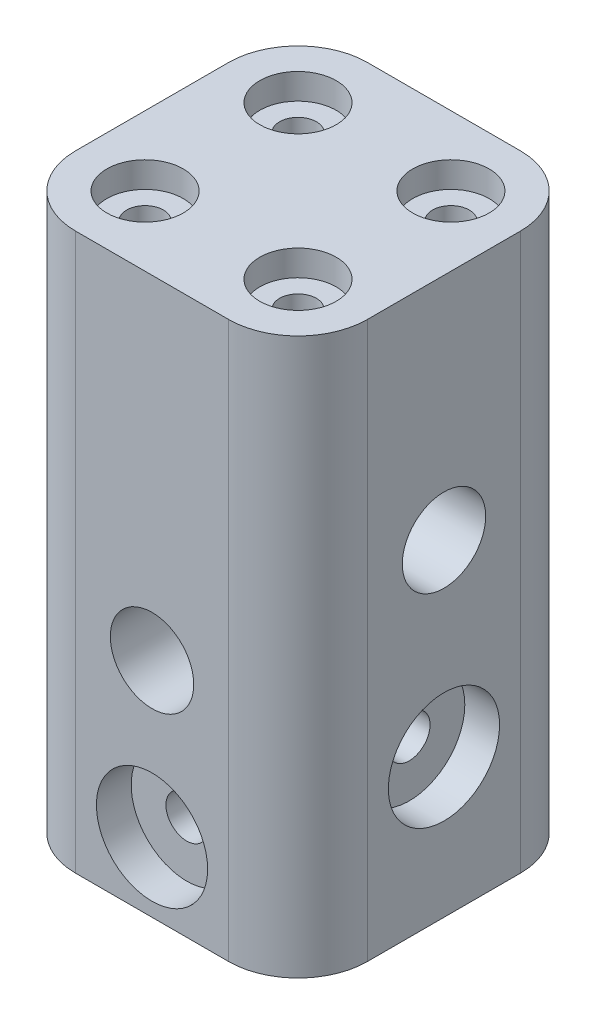
ISO-10303-21;
HEADER;
FILE_DESCRIPTION(('STEP AP214'),'2;1');
FILE_NAME('part.step','',(''),(''),'','','');
FILE_SCHEMA(('AUTOMOTIVE_DESIGN { 1 0 10303 214 1 1 1 1 }'));
ENDSEC;
DATA;
#1=APPLICATION_CONTEXT('core data for automotive mechanical design processes');
#2=APPLICATION_PROTOCOL_DEFINITION('international standard','automotive_design',2000,#1);
#3=PRODUCT_CONTEXT('',#1,'mechanical');
#4=PRODUCT('Part','Part','',(#3));
#5=PRODUCT_RELATED_PRODUCT_CATEGORY('part','',(#4));
#6=PRODUCT_DEFINITION_FORMATION('','',#4);
#7=PRODUCT_DEFINITION_CONTEXT('part definition',#1,'design');
#8=PRODUCT_DEFINITION('design','',#6,#7);
#9=PRODUCT_DEFINITION_SHAPE('','',#8);
#10=(LENGTH_UNIT() NAMED_UNIT(*) SI_UNIT(.MILLI.,.METRE.));
#11=(NAMED_UNIT(*) PLANE_ANGLE_UNIT() SI_UNIT($,.RADIAN.));
#12=(NAMED_UNIT(*) SI_UNIT($,.STERADIAN.) SOLID_ANGLE_UNIT());
#13=UNCERTAINTY_MEASURE_WITH_UNIT(LENGTH_MEASURE(1.E-05),#10,'distance_accuracy_value','');
#14=(GEOMETRIC_REPRESENTATION_CONTEXT(3) GLOBAL_UNCERTAINTY_ASSIGNED_CONTEXT((#13)) GLOBAL_UNIT_ASSIGNED_CONTEXT((#10,
#11,#12)) REPRESENTATION_CONTEXT('',''));
#15=CARTESIAN_POINT('',(0.,0.,0.));
#16=DIRECTION('',(0.,0.,1.));
#17=DIRECTION('',(1.,0.,0.));
#18=AXIS2_PLACEMENT_3D('',#15,#16,#17);
#19=CARTESIAN_POINT('',(-21.,20.,0.));
#20=DIRECTION('',(1.,0.,0.));
#21=DIRECTION('',(0.,0.,-1.));
#22=AXIS2_PLACEMENT_3D('',#19,#20,#21);
#23=CYLINDRICAL_SURFACE('',#22,3.);
#24=CARTESIAN_POINT('',(16.,20.,0.));
#25=DIRECTION('',(1.,0.,0.));
#26=DIRECTION('',(0.,0.,-1.));
#27=AXIS2_PLACEMENT_3D('',#24,#25,#26);
#28=CIRCLE('',#27,3.);
#29=CARTESIAN_POINT('',(16.,20.,-3.));
#30=VERTEX_POINT('',#29);
#31=EDGE_CURVE('E152',#30,#30,#28,.F.);
#32=ORIENTED_EDGE('',*,*,#31,.F.);
#33=EDGE_LOOP('',(#32));
#34=FACE_BOUND('',#33,.T.);
#35=CARTESIAN_POINT('',(-16.,20.,0.));
#36=DIRECTION('',(-1.,0.,0.));
#37=DIRECTION('',(0.,0.,1.));
#38=AXIS2_PLACEMENT_3D('',#35,#36,#37);
#39=CIRCLE('',#38,3.);
#40=CARTESIAN_POINT('',(-16.,20.,3.));
#41=VERTEX_POINT('',#40);
#42=EDGE_CURVE('E157',#41,#41,#39,.F.);
#43=ORIENTED_EDGE('',*,*,#42,.F.);
#44=EDGE_LOOP('',(#43));
#45=FACE_BOUND('',#44,.T.);
#46=ADVANCED_FACE('F35',(#34,#45),#23,.F.);
#47=CARTESIAN_POINT('',(0.,10.,-21.));
#48=DIRECTION('',(0.,0.,1.));
#49=DIRECTION('',(1.,0.,0.));
#50=AXIS2_PLACEMENT_3D('',#47,#48,#49);
#51=CYLINDRICAL_SURFACE('',#50,3.);
#52=CARTESIAN_POINT('',(0.,10.,16.));
#53=DIRECTION('',(0.,0.,1.));
#54=DIRECTION('',(1.,0.,0.));
#55=AXIS2_PLACEMENT_3D('',#52,#53,#54);
#56=CIRCLE('',#55,3.);
#57=CARTESIAN_POINT('',(3.,10.,16.));
#58=VERTEX_POINT('',#57);
#59=EDGE_CURVE('E142',#58,#58,#56,.F.);
#60=CARTESIAN_POINT('',(0.,10.,-16.));
#61=DIRECTION('',(0.,0.,-1.));
#62=DIRECTION('',(-1.,0.,0.));
#63=AXIS2_PLACEMENT_3D('',#60,#61,#62);
#64=CIRCLE('',#63,3.);
#65=CARTESIAN_POINT('',(3.,10.,-16.));
#66=VERTEX_POINT('',#65);
#67=EDGE_CURVE('E147',#66,#66,#64,.F.);
#68=CARTESIAN_POINT('',(3.,10.,16.));
#69=CARTESIAN_POINT('',(3.,10.,15.6666666666667));
#70=CARTESIAN_POINT('',(3.,10.,15.3333333333333));
#71=CARTESIAN_POINT('',(3.,10.,14.6666666666667));
#72=CARTESIAN_POINT('',(3.,10.,14.3333333333333));
#73=CARTESIAN_POINT('',(3.,10.,13.6666666666667));
#74=CARTESIAN_POINT('',(3.,10.,13.3333333333333));
#75=CARTESIAN_POINT('',(3.,10.,12.6666666666667));
#76=CARTESIAN_POINT('',(3.,10.,12.3333333333333));
#77=CARTESIAN_POINT('',(3.,10.,11.6666666666667));
#78=CARTESIAN_POINT('',(3.,10.,11.3333333333333));
#79=CARTESIAN_POINT('',(3.,10.,10.6666666666667));
#80=CARTESIAN_POINT('',(3.,10.,10.3333333333333));
#81=CARTESIAN_POINT('',(3.,10.,9.66666666666667));
#82=CARTESIAN_POINT('',(3.,10.,9.33333333333333));
#83=CARTESIAN_POINT('',(3.,10.,8.66666666666667));
#84=CARTESIAN_POINT('',(3.,10.,8.33333333333333));
#85=CARTESIAN_POINT('',(3.,10.,7.66666666666667));
#86=CARTESIAN_POINT('',(3.,10.,7.33333333333333));
#87=CARTESIAN_POINT('',(3.,10.,6.66666666666667));
#88=CARTESIAN_POINT('',(3.,10.,6.33333333333333));
#89=CARTESIAN_POINT('',(3.,10.,5.66666666666667));
#90=CARTESIAN_POINT('',(3.,10.,5.33333333333333));
#91=CARTESIAN_POINT('',(3.,10.,4.66666666666667));
#92=CARTESIAN_POINT('',(3.,10.,4.33333333333333));
#93=CARTESIAN_POINT('',(3.,10.,3.66666666666667));
#94=CARTESIAN_POINT('',(3.,10.,3.33333333333333));
#95=CARTESIAN_POINT('',(3.,10.,2.66666666666667));
#96=CARTESIAN_POINT('',(3.,10.,2.33333333333333));
#97=CARTESIAN_POINT('',(3.,10.,1.66666666666667));
#98=CARTESIAN_POINT('',(3.,10.,1.33333333333333));
#99=CARTESIAN_POINT('',(3.,10.,0.666666666666667));
#100=CARTESIAN_POINT('',(3.,10.,0.333333333333334));
#101=CARTESIAN_POINT('',(3.,10.,-0.333333333333334));
#102=CARTESIAN_POINT('',(3.,10.,-0.666666666666667));
#103=CARTESIAN_POINT('',(3.,10.,-1.33333333333333));
#104=CARTESIAN_POINT('',(3.,10.,-1.66666666666667));
#105=CARTESIAN_POINT('',(3.,10.,-2.33333333333333));
#106=CARTESIAN_POINT('',(3.,10.,-2.66666666666667));
#107=CARTESIAN_POINT('',(3.,10.,-3.33333333333333));
#108=CARTESIAN_POINT('',(3.,10.,-3.66666666666667));
#109=CARTESIAN_POINT('',(3.,10.,-4.33333333333333));
#110=CARTESIAN_POINT('',(3.,10.,-4.66666666666667));
#111=CARTESIAN_POINT('',(3.,10.,-5.33333333333333));
#112=CARTESIAN_POINT('',(3.,10.,-5.66666666666666));
#113=CARTESIAN_POINT('',(3.,10.,-6.33333333333333));
#114=CARTESIAN_POINT('',(3.,10.,-6.66666666666666));
#115=CARTESIAN_POINT('',(3.,10.,-7.33333333333333));
#116=CARTESIAN_POINT('',(3.,10.,-7.66666666666666));
#117=CARTESIAN_POINT('',(3.,10.,-8.33333333333333));
#118=CARTESIAN_POINT('',(3.,10.,-8.66666666666667));
#119=CARTESIAN_POINT('',(3.,10.,-9.33333333333333));
#120=CARTESIAN_POINT('',(3.,10.,-9.66666666666667));
#121=CARTESIAN_POINT('',(3.,10.,-10.3333333333333));
#122=CARTESIAN_POINT('',(3.,10.,-10.6666666666667));
#123=CARTESIAN_POINT('',(3.,10.,-11.3333333333333));
#124=CARTESIAN_POINT('',(3.,10.,-11.6666666666667));
#125=CARTESIAN_POINT('',(3.,10.,-12.3333333333333));
#126=CARTESIAN_POINT('',(3.,10.,-12.6666666666667));
#127=CARTESIAN_POINT('',(3.,10.,-13.3333333333333));
#128=CARTESIAN_POINT('',(3.,10.,-13.6666666666667));
#129=CARTESIAN_POINT('',(3.,10.,-14.3333333333333));
#130=CARTESIAN_POINT('',(3.,10.,-14.6666666666667));
#131=CARTESIAN_POINT('',(3.,10.,-15.3333333333333));
#132=CARTESIAN_POINT('',(3.,10.,-15.6666666666667));
#133=CARTESIAN_POINT('',(3.,10.,-16.));
#134=B_SPLINE_CURVE_WITH_KNOTS('',3,(#68,#69,#70,#71,#72,#73,#74,#75,#76,#77,#78,#79,#80,#81,
#82,#83,#84,#85,#86,#87,#88,#89,#90,#91,#92,#93,#94,#95,#96,#97,#98,#99,#100,#101,#102,#103,
#104,#105,#106,#107,#108,#109,#110,#111,#112,#113,#114,#115,#116,#117,#118,#119,#120,#121,#122,
#123,#124,#125,#126,#127,#128,#129,#130,#131,#132,#133),.UNSPECIFIED.,.F.,.F.,(4,2,2,2,2,2,2,2,
2,2,2,2,2,2,2,2,2,2,2,2,2,2,2,2,2,2,2,2,2,2,2,2,4),(0.,1.,2.,3.,4.,5.,5.99999999999999,7.,8.,9.,
10.,11.,12.,13.,14.,15.,16.,17.,18.,19.,20.,21.,22.,23.,24.,25.,26.,27.,28.,29.,30.,31.,32.),.UNSPECIFIED.);
#135=EDGE_CURVE('BSEAM302',#58,#66,#134,.T.);
#136=ORIENTED_EDGE('',*,*,#59,.F.);
#137=ORIENTED_EDGE('',*,*,#67,.F.);
#138=ORIENTED_EDGE('',*,*,#135,.T.);
#139=ORIENTED_EDGE('',*,*,#135,.F.);
#140=EDGE_LOOP('',(#136,#138,#137,#139));
#141=FACE_BOUND('',#140,.T.);
#142=ADVANCED_FACE('F302',(#141),#51,.F.);
#143=CARTESIAN_POINT('',(21.,80.,-21.));
#144=DIRECTION('',(-1.,0.,0.));
#145=DIRECTION('',(0.,0.,1.));
#146=AXIS2_PLACEMENT_3D('',#143,#144,#145);
#147=PLANE('',#146);
#148=CARTESIAN_POINT('',(21.,20.,0.));
#149=DIRECTION('',(1.,0.,0.));
#150=DIRECTION('',(0.,0.,-1.));
#151=AXIS2_PLACEMENT_3D('',#148,#149,#150);
#152=CIRCLE('',#151,8.);
#153=CARTESIAN_POINT('',(21.,20.,-8.));
#154=VERTEX_POINT('',#153);
#155=EDGE_CURVE('E160',#154,#154,#152,.T.);
#156=ORIENTED_EDGE('',*,*,#155,.F.);
#157=EDGE_LOOP('',(#156));
#158=FACE_BOUND('',#157,.T.);
#159=CARTESIAN_POINT('',(21.,47.,0.));
#160=DIRECTION('',(1.,0.,0.));
#161=DIRECTION('',(0.,0.,-1.));
#162=AXIS2_PLACEMENT_3D('',#159,#160,#161);
#163=CIRCLE('',#162,6.);
#164=CARTESIAN_POINT('',(21.,47.,-6.));
#165=VERTEX_POINT('',#164);
#166=EDGE_CURVE('E145',#165,#165,#163,.T.);
#167=ORIENTED_EDGE('',*,*,#166,.F.);
#168=EDGE_LOOP('',(#167));
#169=FACE_BOUND('',#168,.T.);
#170=DIRECTION('',(0.,0.,-1.));
#171=VECTOR('',#170,1.);
#172=CARTESIAN_POINT('',(21.,80.,-21.));
#173=LINE('',#172,#171);
#174=CARTESIAN_POINT('',(21.,80.,11.));
#175=VERTEX_POINT('',#174);
#176=CARTESIAN_POINT('',(21.,80.,-11.));
#177=VERTEX_POINT('',#176);
#178=EDGE_CURVE('E120',#175,#177,#173,.T.);
#179=ORIENTED_EDGE('',*,*,#178,.F.);
#180=DIRECTION('',(0.,-1.,0.));
#181=VECTOR('',#180,1.);
#182=CARTESIAN_POINT('',(21.,80.,11.));
#183=LINE('',#182,#181);
#184=CARTESIAN_POINT('',(21.,0.,11.));
#185=VERTEX_POINT('',#184);
#186=EDGE_CURVE('E104',#175,#185,#183,.T.);
#187=ORIENTED_EDGE('',*,*,#186,.T.);
#188=DIRECTION('',(0.,0.,-1.));
#189=VECTOR('',#188,1.);
#190=CARTESIAN_POINT('',(21.,0.,-21.));
#191=LINE('',#190,#189);
#192=CARTESIAN_POINT('',(21.,0.,-11.));
#193=VERTEX_POINT('',#192);
#194=EDGE_CURVE('E117',#185,#193,#191,.T.);
#195=ORIENTED_EDGE('',*,*,#194,.T.);
#196=DIRECTION('',(0.,-1.,0.));
#197=VECTOR('',#196,1.);
#198=CARTESIAN_POINT('',(21.,80.,-11.));
#199=LINE('',#198,#197);
#200=EDGE_CURVE('E122',#193,#177,#199,.F.);
#201=ORIENTED_EDGE('',*,*,#200,.T.);
#202=EDGE_LOOP('',(#179,#187,#195,#201));
#203=FACE_BOUND('',#202,.T.);
#204=ADVANCED_FACE('F116',(#158,#169,#203),#147,.F.);
#205=CARTESIAN_POINT('',(-21.,80.,-21.));
#206=DIRECTION('',(0.,0.,1.));
#207=DIRECTION('',(1.,0.,0.));
#208=AXIS2_PLACEMENT_3D('',#205,#206,#207);
#209=PLANE('',#208);
#210=CARTESIAN_POINT('',(0.,10.,-21.));
#211=DIRECTION('',(0.,0.,-1.));
#212=DIRECTION('',(-1.,0.,0.));
#213=AXIS2_PLACEMENT_3D('',#210,#211,#212);
#214=CIRCLE('',#213,8.);
#215=CARTESIAN_POINT('',(-8.,10.,-21.));
#216=VERTEX_POINT('',#215);
#217=EDGE_CURVE('E155',#216,#216,#214,.T.);
#218=ORIENTED_EDGE('',*,*,#217,.F.);
#219=EDGE_LOOP('',(#218));
#220=FACE_BOUND('',#219,.T.);
#221=CARTESIAN_POINT('',(0.,32.,-21.));
#222=DIRECTION('',(0.,0.,1.));
#223=DIRECTION('',(1.,0.,0.));
#224=AXIS2_PLACEMENT_3D('',#221,#222,#223);
#225=CIRCLE('',#224,6.);
#226=CARTESIAN_POINT('',(6.,32.,-21.));
#227=VERTEX_POINT('',#226);
#228=EDGE_CURVE('E127',#227,#227,#225,.T.);
#229=ORIENTED_EDGE('',*,*,#228,.T.);
#230=EDGE_LOOP('',(#229));
#231=FACE_BOUND('',#230,.T.);
#232=DIRECTION('',(-1.,0.,0.));
#233=VECTOR('',#232,1.);
#234=CARTESIAN_POINT('',(-21.,80.,-21.));
#235=LINE('',#234,#233);
#236=CARTESIAN_POINT('',(11.,80.,-21.));
#237=VERTEX_POINT('',#236);
#238=CARTESIAN_POINT('',(-11.,80.,-21.));
#239=VERTEX_POINT('',#238);
#240=EDGE_CURVE('E195',#237,#239,#235,.T.);
#241=ORIENTED_EDGE('',*,*,#240,.F.);
#242=DIRECTION('',(0.,-1.,0.));
#243=VECTOR('',#242,1.);
#244=CARTESIAN_POINT('',(11.,80.,-21.));
#245=LINE('',#244,#243);
#246=CARTESIAN_POINT('',(11.,0.,-21.));
#247=VERTEX_POINT('',#246);
#248=EDGE_CURVE('E179',#237,#247,#245,.T.);
#249=ORIENTED_EDGE('',*,*,#248,.T.);
#250=DIRECTION('',(-1.,0.,0.));
#251=VECTOR('',#250,1.);
#252=CARTESIAN_POINT('',(-21.,0.,-21.));
#253=LINE('',#252,#251);
#254=CARTESIAN_POINT('',(-11.,0.,-21.));
#255=VERTEX_POINT('',#254);
#256=EDGE_CURVE('E126',#247,#255,#253,.T.);
#257=ORIENTED_EDGE('',*,*,#256,.T.);
#258=DIRECTION('',(0.,-1.,0.));
#259=VECTOR('',#258,1.);
#260=CARTESIAN_POINT('',(-11.,80.,-21.));
#261=LINE('',#260,#259);
#262=EDGE_CURVE('E177',#255,#239,#261,.F.);
#263=ORIENTED_EDGE('',*,*,#262,.T.);
#264=EDGE_LOOP('',(#241,#249,#257,#263));
#265=FACE_BOUND('',#264,.T.);
#266=ADVANCED_FACE('F349',(#220,#231,#265),#209,.F.);
#267=CARTESIAN_POINT('',(-21.,80.,-21.));
#268=DIRECTION('',(1.,0.,0.));
#269=DIRECTION('',(0.,0.,-1.));
#270=AXIS2_PLACEMENT_3D('',#267,#268,#269);
#271=PLANE('',#270);
#272=CARTESIAN_POINT('',(-21.,20.,0.));
#273=DIRECTION('',(-1.,0.,0.));
#274=DIRECTION('',(0.,0.,1.));
#275=AXIS2_PLACEMENT_3D('',#272,#273,#274);
#276=CIRCLE('',#275,8.);
#277=CARTESIAN_POINT('',(-21.,20.,8.));
#278=VERTEX_POINT('',#277);
#279=EDGE_CURVE('E218',#278,#278,#276,.T.);
#280=ORIENTED_EDGE('',*,*,#279,.F.);
#281=EDGE_LOOP('',(#280));
#282=FACE_BOUND('',#281,.T.);
#283=CARTESIAN_POINT('',(-21.,47.,0.));
#284=DIRECTION('',(1.,0.,0.));
#285=DIRECTION('',(0.,0.,-1.));
#286=AXIS2_PLACEMENT_3D('',#283,#284,#285);
#287=CIRCLE('',#286,6.);
#288=CARTESIAN_POINT('',(-21.,47.,-6.));
#289=VERTEX_POINT('',#288);
#290=EDGE_CURVE('E200',#289,#289,#287,.T.);
#291=ORIENTED_EDGE('',*,*,#290,.T.);
#292=EDGE_LOOP('',(#291));
#293=FACE_BOUND('',#292,.T.);
#294=DIRECTION('',(0.,0.,1.));
#295=VECTOR('',#294,1.);
#296=CARTESIAN_POINT('',(-21.,0.,-21.));
#297=LINE('',#296,#295);
#298=CARTESIAN_POINT('',(-21.,0.,-11.));
#299=VERTEX_POINT('',#298);
#300=CARTESIAN_POINT('',(-21.,0.,11.));
#301=VERTEX_POINT('',#300);
#302=EDGE_CURVE('E130',#299,#301,#297,.T.);
#303=ORIENTED_EDGE('',*,*,#302,.T.);
#304=DIRECTION('',(0.,-1.,0.));
#305=VECTOR('',#304,1.);
#306=CARTESIAN_POINT('',(-21.,80.,11.));
#307=LINE('',#306,#305);
#308=CARTESIAN_POINT('',(-21.,80.,11.));
#309=VERTEX_POINT('',#308);
#310=EDGE_CURVE('E11',#301,#309,#307,.F.);
#311=ORIENTED_EDGE('',*,*,#310,.T.);
#312=DIRECTION('',(0.,0.,1.));
#313=VECTOR('',#312,1.);
#314=CARTESIAN_POINT('',(-21.,80.,-21.));
#315=LINE('',#314,#313);
#316=CARTESIAN_POINT('',(-21.,80.,-11.));
#317=VERTEX_POINT('',#316);
#318=EDGE_CURVE('E185',#317,#309,#315,.T.);
#319=ORIENTED_EDGE('',*,*,#318,.F.);
#320=DIRECTION('',(0.,-1.,0.));
#321=VECTOR('',#320,1.);
#322=CARTESIAN_POINT('',(-21.,80.,-11.));
#323=LINE('',#322,#321);
#324=EDGE_CURVE('E43',#317,#299,#323,.T.);
#325=ORIENTED_EDGE('',*,*,#324,.T.);
#326=EDGE_LOOP('',(#303,#311,#319,#325));
#327=FACE_BOUND('',#326,.T.);
#328=ADVANCED_FACE('F184',(#282,#293,#327),#271,.F.);
#329=CARTESIAN_POINT('',(-21.,80.,21.));
#330=DIRECTION('',(0.,0.,-1.));
#331=DIRECTION('',(-1.,0.,0.));
#332=AXIS2_PLACEMENT_3D('',#329,#330,#331);
#333=PLANE('',#332);
#334=CARTESIAN_POINT('',(0.,10.,21.));
#335=DIRECTION('',(0.,0.,1.));
#336=DIRECTION('',(1.,0.,0.));
#337=AXIS2_PLACEMENT_3D('',#334,#335,#336);
#338=CIRCLE('',#337,8.);
#339=CARTESIAN_POINT('',(8.,10.,21.));
#340=VERTEX_POINT('',#339);
#341=EDGE_CURVE('E150',#340,#340,#338,.T.);
#342=ORIENTED_EDGE('',*,*,#341,.F.);
#343=EDGE_LOOP('',(#342));
#344=FACE_BOUND('',#343,.T.);
#345=CARTESIAN_POINT('',(0.,32.,21.));
#346=DIRECTION('',(0.,0.,1.));
#347=DIRECTION('',(1.,0.,0.));
#348=AXIS2_PLACEMENT_3D('',#345,#346,#347);
#349=CIRCLE('',#348,6.);
#350=CARTESIAN_POINT('',(6.,32.,21.));
#351=VERTEX_POINT('',#350);
#352=EDGE_CURVE('E133',#351,#351,#349,.T.);
#353=ORIENTED_EDGE('',*,*,#352,.F.);
#354=EDGE_LOOP('',(#353));
#355=FACE_BOUND('',#354,.T.);
#356=DIRECTION('',(1.,0.,0.));
#357=VECTOR('',#356,1.);
#358=CARTESIAN_POINT('',(-21.,0.,21.));
#359=LINE('',#358,#357);
#360=CARTESIAN_POINT('',(-11.,0.,21.));
#361=VERTEX_POINT('',#360);
#362=CARTESIAN_POINT('',(11.,0.,21.));
#363=VERTEX_POINT('',#362);
#364=EDGE_CURVE('E140',#361,#363,#359,.T.);
#365=ORIENTED_EDGE('',*,*,#364,.T.);
#366=DIRECTION('',(0.,-1.,0.));
#367=VECTOR('',#366,1.);
#368=CARTESIAN_POINT('',(11.,80.,21.));
#369=LINE('',#368,#367);
#370=CARTESIAN_POINT('',(11.,80.,21.));
#371=VERTEX_POINT('',#370);
#372=EDGE_CURVE('E105',#363,#371,#369,.F.);
#373=ORIENTED_EDGE('',*,*,#372,.T.);
#374=DIRECTION('',(1.,0.,0.));
#375=VECTOR('',#374,1.);
#376=CARTESIAN_POINT('',(-21.,80.,21.));
#377=LINE('',#376,#375);
#378=CARTESIAN_POINT('',(-11.,80.,21.));
#379=VERTEX_POINT('',#378);
#380=EDGE_CURVE('E136',#379,#371,#377,.T.);
#381=ORIENTED_EDGE('',*,*,#380,.F.);
#382=DIRECTION('',(0.,-1.,0.));
#383=VECTOR('',#382,1.);
#384=CARTESIAN_POINT('',(-11.,80.,21.));
#385=LINE('',#384,#383);
#386=EDGE_CURVE('E110',#379,#361,#385,.T.);
#387=ORIENTED_EDGE('',*,*,#386,.T.);
#388=EDGE_LOOP('',(#365,#373,#381,#387));
#389=FACE_BOUND('',#388,.T.);
#390=ADVANCED_FACE('F193',(#344,#355,#389),#333,.F.);
#391=CARTESIAN_POINT('',(0.,80.,0.));
#392=DIRECTION('',(0.,1.,0.));
#393=DIRECTION('',(0.,0.,1.));
#394=AXIS2_PLACEMENT_3D('',#391,#392,#393);
#395=PLANE('',#394);
#396=CARTESIAN_POINT('',(-11.,80.,-11.));
#397=DIRECTION('',(0.,1.,0.));
#398=DIRECTION('',(0.,0.,1.));
#399=AXIS2_PLACEMENT_3D('',#396,#397,#398);
#400=CIRCLE('',#399,5.49999999999999);
#401=CARTESIAN_POINT('',(-11.,80.,-5.50000000000001));
#402=VERTEX_POINT('',#401);
#403=EDGE_CURVE('E268',#402,#402,#400,.T.);
#404=ORIENTED_EDGE('',*,*,#403,.F.);
#405=EDGE_LOOP('',(#404));
#406=FACE_BOUND('',#405,.T.);
#407=CARTESIAN_POINT('',(11.,80.,-11.));
#408=DIRECTION('',(0.,1.,0.));
#409=DIRECTION('',(0.,0.,1.));
#410=AXIS2_PLACEMENT_3D('',#407,#408,#409);
#411=CIRCLE('',#410,5.5);
#412=CARTESIAN_POINT('',(11.,80.,-5.50000000000001));
#413=VERTEX_POINT('',#412);
#414=EDGE_CURVE('E256',#413,#413,#411,.T.);
#415=ORIENTED_EDGE('',*,*,#414,.F.);
#416=EDGE_LOOP('',(#415));
#417=FACE_BOUND('',#416,.T.);
#418=CARTESIAN_POINT('',(11.,80.,11.));
#419=DIRECTION('',(0.,1.,0.));
#420=DIRECTION('',(0.,0.,1.));
#421=AXIS2_PLACEMENT_3D('',#418,#419,#420);
#422=CIRCLE('',#421,5.49999999999999);
#423=CARTESIAN_POINT('',(11.,80.,16.5));
#424=VERTEX_POINT('',#423);
#425=EDGE_CURVE('E244',#424,#424,#422,.T.);
#426=ORIENTED_EDGE('',*,*,#425,.F.);
#427=EDGE_LOOP('',(#426));
#428=FACE_BOUND('',#427,.T.);
#429=CARTESIAN_POINT('',(-11.,80.,11.));
#430=DIRECTION('',(0.,1.,0.));
#431=DIRECTION('',(0.,0.,1.));
#432=AXIS2_PLACEMENT_3D('',#429,#430,#431);
#433=CIRCLE('',#432,5.49999999999999);
#434=CARTESIAN_POINT('',(-11.,80.,16.5));
#435=VERTEX_POINT('',#434);
#436=EDGE_CURVE('E232',#435,#435,#433,.T.);
#437=ORIENTED_EDGE('',*,*,#436,.F.);
#438=EDGE_LOOP('',(#437));
#439=FACE_BOUND('',#438,.T.);
#440=ORIENTED_EDGE('',*,*,#380,.T.);
#441=CARTESIAN_POINT('',(11.,80.,11.));
#442=DIRECTION('',(0.,1.,0.));
#443=DIRECTION('',(0.,0.,1.));
#444=AXIS2_PLACEMENT_3D('',#441,#442,#443);
#445=CIRCLE('',#444,10.);
#446=EDGE_CURVE('E175',#371,#175,#445,.T.);
#447=ORIENTED_EDGE('',*,*,#446,.T.);
#448=ORIENTED_EDGE('',*,*,#178,.T.);
#449=CARTESIAN_POINT('',(11.,80.,-11.));
#450=DIRECTION('',(0.,1.,0.));
#451=DIRECTION('',(0.,0.,1.));
#452=AXIS2_PLACEMENT_3D('',#449,#450,#451);
#453=CIRCLE('',#452,10.);
#454=EDGE_CURVE('E173',#177,#237,#453,.T.);
#455=ORIENTED_EDGE('',*,*,#454,.T.);
#456=ORIENTED_EDGE('',*,*,#240,.T.);
#457=CARTESIAN_POINT('',(-11.,80.,-11.));
#458=DIRECTION('',(0.,1.,0.));
#459=DIRECTION('',(0.,0.,1.));
#460=AXIS2_PLACEMENT_3D('',#457,#458,#459);
#461=CIRCLE('',#460,10.);
#462=EDGE_CURVE('E55',#239,#317,#461,.T.);
#463=ORIENTED_EDGE('',*,*,#462,.T.);
#464=ORIENTED_EDGE('',*,*,#318,.T.);
#465=CARTESIAN_POINT('',(-11.,80.,11.));
#466=DIRECTION('',(0.,1.,0.));
#467=DIRECTION('',(0.,0.,1.));
#468=AXIS2_PLACEMENT_3D('',#465,#466,#467);
#469=CIRCLE('',#468,10.);
#470=EDGE_CURVE('E171',#309,#379,#469,.T.);
#471=ORIENTED_EDGE('',*,*,#470,.T.);
#472=EDGE_LOOP('',(#440,#447,#448,#455,#456,#463,#464,#471));
#473=FACE_BOUND('',#472,.T.);
#474=ADVANCED_FACE('F274',(#406,#417,#428,#439,#473),#395,.T.);
#475=CARTESIAN_POINT('',(0.,0.,0.));
#476=DIRECTION('',(0.,1.,0.));
#477=DIRECTION('',(0.,0.,1.));
#478=AXIS2_PLACEMENT_3D('',#475,#476,#477);
#479=PLANE('',#478);
#480=CARTESIAN_POINT('',(-11.,0.,-11.));
#481=DIRECTION('',(0.,1.,0.));
#482=DIRECTION('',(0.,0.,1.));
#483=AXIS2_PLACEMENT_3D('',#480,#481,#482);
#484=CIRCLE('',#483,2.64999999999998);
#485=CARTESIAN_POINT('',(-11.,0.,-8.35000000000002));
#486=VERTEX_POINT('',#485);
#487=EDGE_CURVE('E259',#486,#486,#484,.T.);
#488=ORIENTED_EDGE('',*,*,#487,.T.);
#489=EDGE_LOOP('',(#488));
#490=FACE_BOUND('',#489,.T.);
#491=CARTESIAN_POINT('',(11.,0.,-11.));
#492=DIRECTION('',(0.,1.,0.));
#493=DIRECTION('',(0.,0.,1.));
#494=AXIS2_PLACEMENT_3D('',#491,#492,#493);
#495=CIRCLE('',#494,2.64999999999998);
#496=CARTESIAN_POINT('',(11.,0.,-8.35000000000002));
#497=VERTEX_POINT('',#496);
#498=EDGE_CURVE('E247',#497,#497,#495,.T.);
#499=ORIENTED_EDGE('',*,*,#498,.T.);
#500=EDGE_LOOP('',(#499));
#501=FACE_BOUND('',#500,.T.);
#502=CARTESIAN_POINT('',(11.,0.,11.));
#503=DIRECTION('',(0.,1.,0.));
#504=DIRECTION('',(0.,0.,1.));
#505=AXIS2_PLACEMENT_3D('',#502,#503,#504);
#506=CIRCLE('',#505,2.64999999999998);
#507=CARTESIAN_POINT('',(11.,0.,13.65));
#508=VERTEX_POINT('',#507);
#509=EDGE_CURVE('E235',#508,#508,#506,.T.);
#510=ORIENTED_EDGE('',*,*,#509,.T.);
#511=EDGE_LOOP('',(#510));
#512=FACE_BOUND('',#511,.T.);
#513=CARTESIAN_POINT('',(-11.,0.,11.));
#514=DIRECTION('',(0.,1.,0.));
#515=DIRECTION('',(0.,0.,1.));
#516=AXIS2_PLACEMENT_3D('',#513,#514,#515);
#517=CIRCLE('',#516,2.64999999999998);
#518=CARTESIAN_POINT('',(-11.,0.,13.65));
#519=VERTEX_POINT('',#518);
#520=EDGE_CURVE('E221',#519,#519,#517,.T.);
#521=ORIENTED_EDGE('',*,*,#520,.T.);
#522=EDGE_LOOP('',(#521));
#523=FACE_BOUND('',#522,.T.);
#524=ORIENTED_EDGE('',*,*,#194,.F.);
#525=CARTESIAN_POINT('',(11.,0.,11.));
#526=DIRECTION('',(0.,1.,0.));
#527=DIRECTION('',(0.,0.,1.));
#528=AXIS2_PLACEMENT_3D('',#525,#526,#527);
#529=CIRCLE('',#528,10.);
#530=EDGE_CURVE('E100',#185,#363,#529,.F.);
#531=ORIENTED_EDGE('',*,*,#530,.T.);
#532=ORIENTED_EDGE('',*,*,#364,.F.);
#533=CARTESIAN_POINT('',(-11.,0.,11.));
#534=DIRECTION('',(0.,1.,0.));
#535=DIRECTION('',(0.,0.,1.));
#536=AXIS2_PLACEMENT_3D('',#533,#534,#535);
#537=CIRCLE('',#536,10.);
#538=EDGE_CURVE('E164',#361,#301,#537,.F.);
#539=ORIENTED_EDGE('',*,*,#538,.T.);
#540=ORIENTED_EDGE('',*,*,#302,.F.);
#541=CARTESIAN_POINT('',(-11.,0.,-11.));
#542=DIRECTION('',(0.,1.,0.));
#543=DIRECTION('',(0.,0.,1.));
#544=AXIS2_PLACEMENT_3D('',#541,#542,#543);
#545=CIRCLE('',#544,10.);
#546=EDGE_CURVE('E121',#299,#255,#545,.F.);
#547=ORIENTED_EDGE('',*,*,#546,.T.);
#548=ORIENTED_EDGE('',*,*,#256,.F.);
#549=CARTESIAN_POINT('',(11.,0.,-11.));
#550=DIRECTION('',(0.,1.,0.));
#551=DIRECTION('',(0.,0.,1.));
#552=AXIS2_PLACEMENT_3D('',#549,#550,#551);
#553=CIRCLE('',#552,10.);
#554=EDGE_CURVE('E111',#247,#193,#553,.F.);
#555=ORIENTED_EDGE('',*,*,#554,.T.);
#556=EDGE_LOOP('',(#524,#531,#532,#539,#540,#547,#548,#555));
#557=FACE_BOUND('',#556,.T.);
#558=ADVANCED_FACE('F124',(#490,#501,#512,#523,#557),#479,.F.);
#559=CARTESIAN_POINT('',(0.,32.,-21.));
#560=DIRECTION('',(0.,0.,1.));
#561=DIRECTION('',(1.,0.,0.));
#562=AXIS2_PLACEMENT_3D('',#559,#560,#561);
#563=CYLINDRICAL_SURFACE('',#562,6.);
#564=CARTESIAN_POINT('',(6.,32.,-21.));
#565=CARTESIAN_POINT('',(6.,32.,-20.5625));
#566=CARTESIAN_POINT('',(6.,32.,-20.125));
#567=CARTESIAN_POINT('',(6.,32.,-19.25));
#568=CARTESIAN_POINT('',(6.,32.,-18.8125));
#569=CARTESIAN_POINT('',(6.,32.,-17.9375));
#570=CARTESIAN_POINT('',(6.,32.,-17.5));
#571=CARTESIAN_POINT('',(6.,32.,-16.625));
#572=CARTESIAN_POINT('',(6.,32.,-16.1875));
#573=CARTESIAN_POINT('',(6.,32.,-15.3125));
#574=CARTESIAN_POINT('',(6.,32.,-14.875));
#575=CARTESIAN_POINT('',(6.,32.,-14.));
#576=CARTESIAN_POINT('',(6.,32.,-13.5625));
#577=CARTESIAN_POINT('',(6.,32.,-12.6875));
#578=CARTESIAN_POINT('',(6.,32.,-12.25));
#579=CARTESIAN_POINT('',(6.,32.,-11.375));
#580=CARTESIAN_POINT('',(6.,32.,-10.9375));
#581=CARTESIAN_POINT('',(6.,32.,-10.0625));
#582=CARTESIAN_POINT('',(6.,32.,-9.625));
#583=CARTESIAN_POINT('',(6.,32.,-8.75));
#584=CARTESIAN_POINT('',(6.,32.,-8.3125));
#585=CARTESIAN_POINT('',(6.,32.,-7.4375));
#586=CARTESIAN_POINT('',(6.,32.,-7.));
#587=CARTESIAN_POINT('',(6.,32.,-6.125));
#588=CARTESIAN_POINT('',(6.,32.,-5.6875));
#589=CARTESIAN_POINT('',(6.,32.,-4.8125));
#590=CARTESIAN_POINT('',(6.,32.,-4.375));
#591=CARTESIAN_POINT('',(6.,32.,-3.5));
#592=CARTESIAN_POINT('',(6.,32.,-3.0625));
#593=CARTESIAN_POINT('',(6.,32.,-2.1875));
#594=CARTESIAN_POINT('',(6.,32.,-1.75));
#595=CARTESIAN_POINT('',(6.,32.,-0.875000000000001));
#596=CARTESIAN_POINT('',(6.,32.,-0.4375));
#597=CARTESIAN_POINT('',(6.,32.,0.4375));
#598=CARTESIAN_POINT('',(6.,32.,0.875000000000001));
#599=CARTESIAN_POINT('',(6.,32.,1.75));
#600=CARTESIAN_POINT('',(6.,32.,2.1875));
#601=CARTESIAN_POINT('',(6.,32.,3.0625));
#602=CARTESIAN_POINT('',(6.,32.,3.5));
#603=CARTESIAN_POINT('',(6.,32.,4.375));
#604=CARTESIAN_POINT('',(6.,32.,4.8125));
#605=CARTESIAN_POINT('',(6.,32.,5.6875));
#606=CARTESIAN_POINT('',(6.,32.,6.125));
#607=CARTESIAN_POINT('',(6.,32.,7.));
#608=CARTESIAN_POINT('',(6.,32.,7.4375));
#609=CARTESIAN_POINT('',(6.,32.,8.3125));
#610=CARTESIAN_POINT('',(6.,32.,8.75));
#611=CARTESIAN_POINT('',(6.,32.,9.625));
#612=CARTESIAN_POINT('',(6.,32.,10.0625));
#613=CARTESIAN_POINT('',(6.,32.,10.9375));
#614=CARTESIAN_POINT('',(6.,32.,11.375));
#615=CARTESIAN_POINT('',(6.,32.,12.25));
#616=CARTESIAN_POINT('',(6.,32.,12.6875));
#617=CARTESIAN_POINT('',(6.,32.,13.5625));
#618=CARTESIAN_POINT('',(6.,32.,14.));
#619=CARTESIAN_POINT('',(6.,32.,14.875));
#620=CARTESIAN_POINT('',(6.,32.,15.3125));
#621=CARTESIAN_POINT('',(6.,32.,16.1875));
#622=CARTESIAN_POINT('',(6.,32.,16.625));
#623=CARTESIAN_POINT('',(6.,32.,17.5));
#624=CARTESIAN_POINT('',(6.,32.,17.9375));
#625=CARTESIAN_POINT('',(6.,32.,18.8125));
#626=CARTESIAN_POINT('',(6.,32.,19.25));
#627=CARTESIAN_POINT('',(6.,32.,20.125));
#628=CARTESIAN_POINT('',(6.,32.,20.5625));
#629=CARTESIAN_POINT('',(6.,32.,21.));
#630=B_SPLINE_CURVE_WITH_KNOTS('',3,(#564,#565,#566,#567,#568,#569,#570,#571,#572,#573,#574,
#575,#576,#577,#578,#579,#580,#581,#582,#583,#584,#585,#586,#587,#588,#589,#590,#591,#592,#593,
#594,#595,#596,#597,#598,#599,#600,#601,#602,#603,#604,#605,#606,#607,#608,#609,#610,#611,#612,
#613,#614,#615,#616,#617,#618,#619,#620,#621,#622,#623,#624,#625,#626,#627,#628,#629),
.UNSPECIFIED.,.F.,.F.,(4,2,2,2,2,2,2,2,2,2,2,2,2,2,2,2,2,2,2,2,2,2,2,2,2,2,2,2,2,2,2,2,4),(0.,
1.3125,2.625,3.9375,5.25,6.5625,7.875,9.1875,10.5,11.8125,13.125,14.4375,15.75,17.0625,18.375,
19.6875,21.,22.3125,23.625,24.9375,26.25,27.5625,28.875,30.1875,31.5,32.8125,34.125,35.4375,
36.75,38.0625,39.375,40.6875,42.),.UNSPECIFIED.);
#631=EDGE_CURVE('BSEAM336',#227,#351,#630,.T.);
#632=ORIENTED_EDGE('',*,*,#228,.F.);
#633=ORIENTED_EDGE('',*,*,#352,.T.);
#634=ORIENTED_EDGE('',*,*,#631,.T.);
#635=ORIENTED_EDGE('',*,*,#631,.F.);
#636=EDGE_LOOP('',(#632,#634,#633,#635));
#637=FACE_BOUND('',#636,.T.);
#638=ADVANCED_FACE('F336',(#637),#563,.F.);
#639=CARTESIAN_POINT('',(-21.,47.,0.));
#640=DIRECTION('',(1.,0.,0.));
#641=DIRECTION('',(0.,0.,-1.));
#642=AXIS2_PLACEMENT_3D('',#639,#640,#641);
#643=CYLINDRICAL_SURFACE('',#642,6.);
#644=ORIENTED_EDGE('',*,*,#290,.F.);
#645=EDGE_LOOP('',(#644));
#646=FACE_BOUND('',#645,.T.);
#647=ORIENTED_EDGE('',*,*,#166,.T.);
#648=EDGE_LOOP('',(#647));
#649=FACE_BOUND('',#648,.T.);
#650=ADVANCED_FACE('F329',(#646,#649),#643,.F.);
#651=CARTESIAN_POINT('',(0.,10.,16.));
#652=DIRECTION('',(0.,0.,1.));
#653=DIRECTION('',(1.,0.,0.));
#654=AXIS2_PLACEMENT_3D('',#651,#652,#653);
#655=PLANE('',#654);
#656=CARTESIAN_POINT('',(0.,10.,16.));
#657=DIRECTION('',(0.,0.,1.));
#658=DIRECTION('',(1.,0.,0.));
#659=AXIS2_PLACEMENT_3D('',#656,#657,#658);
#660=CIRCLE('',#659,8.);
#661=CARTESIAN_POINT('',(8.,10.,16.));
#662=VERTEX_POINT('',#661);
#663=EDGE_CURVE('E146',#662,#662,#660,.T.);
#664=ORIENTED_EDGE('',*,*,#663,.T.);
#665=EDGE_LOOP('',(#664));
#666=FACE_BOUND('',#665,.T.);
#667=ORIENTED_EDGE('',*,*,#59,.T.);
#668=EDGE_LOOP('',(#667));
#669=FACE_BOUND('',#668,.T.);
#670=ADVANCED_FACE('F326',(#666,#669),#655,.T.);
#671=CARTESIAN_POINT('',(0.,10.,16.));
#672=DIRECTION('',(0.,0.,1.));
#673=DIRECTION('',(1.,0.,0.));
#674=AXIS2_PLACEMENT_3D('',#671,#672,#673);
#675=CYLINDRICAL_SURFACE('',#674,8.);
#676=ORIENTED_EDGE('',*,*,#663,.F.);
#677=EDGE_LOOP('',(#676));
#678=FACE_BOUND('',#677,.T.);
#679=ORIENTED_EDGE('',*,*,#341,.T.);
#680=EDGE_LOOP('',(#679));
#681=FACE_BOUND('',#680,.T.);
#682=ADVANCED_FACE('F320',(#678,#681),#675,.F.);
#683=CARTESIAN_POINT('',(0.,10.,-16.));
#684=DIRECTION('',(0.,0.,-1.));
#685=DIRECTION('',(-1.,0.,0.));
#686=AXIS2_PLACEMENT_3D('',#683,#684,#685);
#687=PLANE('',#686);
#688=CARTESIAN_POINT('',(0.,10.,-16.));
#689=DIRECTION('',(0.,0.,-1.));
#690=DIRECTION('',(-1.,0.,0.));
#691=AXIS2_PLACEMENT_3D('',#688,#689,#690);
#692=CIRCLE('',#691,8.);
#693=CARTESIAN_POINT('',(-8.,10.,-16.));
#694=VERTEX_POINT('',#693);
#695=EDGE_CURVE('E151',#694,#694,#692,.T.);
#696=ORIENTED_EDGE('',*,*,#695,.T.);
#697=EDGE_LOOP('',(#696));
#698=FACE_BOUND('',#697,.T.);
#699=ORIENTED_EDGE('',*,*,#67,.T.);
#700=EDGE_LOOP('',(#699));
#701=FACE_BOUND('',#700,.T.);
#702=ADVANCED_FACE('F316',(#698,#701),#687,.T.);
#703=CARTESIAN_POINT('',(0.,10.,-16.));
#704=DIRECTION('',(0.,0.,-1.));
#705=DIRECTION('',(-1.,0.,0.));
#706=AXIS2_PLACEMENT_3D('',#703,#704,#705);
#707=CYLINDRICAL_SURFACE('',#706,8.);
#708=ORIENTED_EDGE('',*,*,#695,.F.);
#709=EDGE_LOOP('',(#708));
#710=FACE_BOUND('',#709,.T.);
#711=ORIENTED_EDGE('',*,*,#217,.T.);
#712=EDGE_LOOP('',(#711));
#713=FACE_BOUND('',#712,.T.);
#714=ADVANCED_FACE('F319',(#710,#713),#707,.F.);
#715=CARTESIAN_POINT('',(16.,20.,0.));
#716=DIRECTION('',(1.,0.,0.));
#717=DIRECTION('',(0.,0.,-1.));
#718=AXIS2_PLACEMENT_3D('',#715,#716,#717);
#719=PLANE('',#718);
#720=CARTESIAN_POINT('',(16.,20.,0.));
#721=DIRECTION('',(1.,0.,0.));
#722=DIRECTION('',(0.,0.,-1.));
#723=AXIS2_PLACEMENT_3D('',#720,#721,#722);
#724=CIRCLE('',#723,8.);
#725=CARTESIAN_POINT('',(16.,20.,-8.));
#726=VERTEX_POINT('',#725);
#727=EDGE_CURVE('E156',#726,#726,#724,.T.);
#728=ORIENTED_EDGE('',*,*,#727,.T.);
#729=EDGE_LOOP('',(#728));
#730=FACE_BOUND('',#729,.T.);
#731=ORIENTED_EDGE('',*,*,#31,.T.);
#732=EDGE_LOOP('',(#731));
#733=FACE_BOUND('',#732,.T.);
#734=ADVANCED_FACE('F324',(#730,#733),#719,.T.);
#735=CARTESIAN_POINT('',(16.,20.,0.));
#736=DIRECTION('',(1.,0.,0.));
#737=DIRECTION('',(0.,0.,-1.));
#738=AXIS2_PLACEMENT_3D('',#735,#736,#737);
#739=CYLINDRICAL_SURFACE('',#738,8.);
#740=ORIENTED_EDGE('',*,*,#727,.F.);
#741=EDGE_LOOP('',(#740));
#742=FACE_BOUND('',#741,.T.);
#743=ORIENTED_EDGE('',*,*,#155,.T.);
#744=EDGE_LOOP('',(#743));
#745=FACE_BOUND('',#744,.T.);
#746=ADVANCED_FACE('F314',(#742,#745),#739,.F.);
#747=CARTESIAN_POINT('',(-16.,20.,0.));
#748=DIRECTION('',(-1.,0.,0.));
#749=DIRECTION('',(0.,0.,1.));
#750=AXIS2_PLACEMENT_3D('',#747,#748,#749);
#751=PLANE('',#750);
#752=CARTESIAN_POINT('',(-16.,20.,0.));
#753=DIRECTION('',(-1.,0.,0.));
#754=DIRECTION('',(0.,0.,1.));
#755=AXIS2_PLACEMENT_3D('',#752,#753,#754);
#756=CIRCLE('',#755,8.);
#757=CARTESIAN_POINT('',(-16.,20.,8.));
#758=VERTEX_POINT('',#757);
#759=EDGE_CURVE('E161',#758,#758,#756,.T.);
#760=ORIENTED_EDGE('',*,*,#759,.T.);
#761=EDGE_LOOP('',(#760));
#762=FACE_BOUND('',#761,.T.);
#763=ORIENTED_EDGE('',*,*,#42,.T.);
#764=EDGE_LOOP('',(#763));
#765=FACE_BOUND('',#764,.T.);
#766=ADVANCED_FACE('F382',(#762,#765),#751,.T.);
#767=CARTESIAN_POINT('',(-16.,20.,0.));
#768=DIRECTION('',(-1.,0.,0.));
#769=DIRECTION('',(0.,0.,1.));
#770=AXIS2_PLACEMENT_3D('',#767,#768,#769);
#771=CYLINDRICAL_SURFACE('',#770,8.);
#772=ORIENTED_EDGE('',*,*,#759,.F.);
#773=EDGE_LOOP('',(#772));
#774=FACE_BOUND('',#773,.T.);
#775=ORIENTED_EDGE('',*,*,#279,.T.);
#776=EDGE_LOOP('',(#775));
#777=FACE_BOUND('',#776,.T.);
#778=ADVANCED_FACE('F360',(#774,#777),#771,.F.);
#779=CARTESIAN_POINT('',(11.,80.,11.));
#780=DIRECTION('',(0.,-1.,0.));
#781=DIRECTION('',(0.,0.,-1.));
#782=AXIS2_PLACEMENT_3D('',#779,#780,#781);
#783=CYLINDRICAL_SURFACE('',#782,10.);
#784=ORIENTED_EDGE('',*,*,#446,.F.);
#785=ORIENTED_EDGE('',*,*,#372,.F.);
#786=ORIENTED_EDGE('',*,*,#530,.F.);
#787=ORIENTED_EDGE('',*,*,#186,.F.);
#788=EDGE_LOOP('',(#784,#785,#786,#787));
#789=FACE_BOUND('',#788,.T.);
#790=ADVANCED_FACE('F103',(#789),#783,.T.);
#791=CARTESIAN_POINT('',(11.,80.,-11.));
#792=DIRECTION('',(0.,-1.,0.));
#793=DIRECTION('',(0.,0.,-1.));
#794=AXIS2_PLACEMENT_3D('',#791,#792,#793);
#795=CYLINDRICAL_SURFACE('',#794,10.);
#796=ORIENTED_EDGE('',*,*,#454,.F.);
#797=ORIENTED_EDGE('',*,*,#200,.F.);
#798=ORIENTED_EDGE('',*,*,#554,.F.);
#799=ORIENTED_EDGE('',*,*,#248,.F.);
#800=EDGE_LOOP('',(#796,#797,#798,#799));
#801=FACE_BOUND('',#800,.T.);
#802=ADVANCED_FACE('F359',(#801),#795,.T.);
#803=CARTESIAN_POINT('',(-11.,80.,11.));
#804=DIRECTION('',(0.,-1.,0.));
#805=DIRECTION('',(0.,0.,-1.));
#806=AXIS2_PLACEMENT_3D('',#803,#804,#805);
#807=CYLINDRICAL_SURFACE('',#806,10.);
#808=ORIENTED_EDGE('',*,*,#470,.F.);
#809=ORIENTED_EDGE('',*,*,#310,.F.);
#810=ORIENTED_EDGE('',*,*,#538,.F.);
#811=ORIENTED_EDGE('',*,*,#386,.F.);
#812=EDGE_LOOP('',(#808,#809,#810,#811));
#813=FACE_BOUND('',#812,.T.);
#814=ADVANCED_FACE('F190',(#813),#807,.T.);
#815=CARTESIAN_POINT('',(-11.,80.,-11.));
#816=DIRECTION('',(0.,-1.,0.));
#817=DIRECTION('',(0.,0.,-1.));
#818=AXIS2_PLACEMENT_3D('',#815,#816,#817);
#819=CYLINDRICAL_SURFACE('',#818,10.);
#820=ORIENTED_EDGE('',*,*,#462,.F.);
#821=ORIENTED_EDGE('',*,*,#262,.F.);
#822=ORIENTED_EDGE('',*,*,#546,.F.);
#823=ORIENTED_EDGE('',*,*,#324,.F.);
#824=EDGE_LOOP('',(#820,#821,#822,#823));
#825=FACE_BOUND('',#824,.T.);
#826=ADVANCED_FACE('F37',(#825),#819,.T.);
#827=CARTESIAN_POINT('',(-11.,80.,11.));
#828=DIRECTION('',(0.,1.,0.));
#829=DIRECTION('',(0.,0.,1.));
#830=AXIS2_PLACEMENT_3D('',#827,#828,#829);
#831=CYLINDRICAL_SURFACE('',#830,2.64999999999999);
#832=ORIENTED_EDGE('',*,*,#520,.F.);
#833=EDGE_LOOP('',(#832));
#834=FACE_BOUND('',#833,.T.);
#835=CARTESIAN_POINT('',(-11.,76.3,11.));
#836=DIRECTION('',(0.,1.,0.));
#837=DIRECTION('',(0.,0.,1.));
#838=AXIS2_PLACEMENT_3D('',#835,#836,#837);
#839=CIRCLE('',#838,2.65);
#840=CARTESIAN_POINT('',(-11.,76.3,13.65));
#841=VERTEX_POINT('',#840);
#842=EDGE_CURVE('E226',#841,#841,#839,.T.);
#843=ORIENTED_EDGE('',*,*,#842,.T.);
#844=EDGE_LOOP('',(#843));
#845=FACE_BOUND('',#844,.T.);
#846=ADVANCED_FACE('F297',(#834,#845),#831,.F.);
#847=CARTESIAN_POINT('',(-8.35000000000001,76.3,11.));
#848=DIRECTION('',(0.,-1.,0.));
#849=DIRECTION('',(0.,0.,-1.));
#850=AXIS2_PLACEMENT_3D('',#847,#848,#849);
#851=PLANE('',#850);
#852=ORIENTED_EDGE('',*,*,#842,.F.);
#853=EDGE_LOOP('',(#852));
#854=FACE_BOUND('',#853,.T.);
#855=CARTESIAN_POINT('',(-11.,76.3,11.));
#856=DIRECTION('',(0.,1.,0.));
#857=DIRECTION('',(0.,0.,1.));
#858=AXIS2_PLACEMENT_3D('',#855,#856,#857);
#859=CIRCLE('',#858,5.5);
#860=CARTESIAN_POINT('',(-11.,76.3,16.5));
#861=VERTEX_POINT('',#860);
#862=EDGE_CURVE('E229',#861,#861,#859,.T.);
#863=ORIENTED_EDGE('',*,*,#862,.T.);
#864=EDGE_LOOP('',(#863));
#865=FACE_BOUND('',#864,.T.);
#866=ADVANCED_FACE('F287',(#854,#865),#851,.F.);
#867=CARTESIAN_POINT('',(-11.,80.,11.));
#868=DIRECTION('',(0.,1.,0.));
#869=DIRECTION('',(0.,0.,1.));
#870=AXIS2_PLACEMENT_3D('',#867,#868,#869);
#871=CYLINDRICAL_SURFACE('',#870,5.5);
#872=ORIENTED_EDGE('',*,*,#862,.F.);
#873=EDGE_LOOP('',(#872));
#874=FACE_BOUND('',#873,.T.);
#875=ORIENTED_EDGE('',*,*,#436,.T.);
#876=EDGE_LOOP('',(#875));
#877=FACE_BOUND('',#876,.T.);
#878=ADVANCED_FACE('F284',(#874,#877),#871,.F.);
#879=CARTESIAN_POINT('',(11.,80.,11.));
#880=DIRECTION('',(0.,1.,0.));
#881=DIRECTION('',(0.,0.,1.));
#882=AXIS2_PLACEMENT_3D('',#879,#880,#881);
#883=CYLINDRICAL_SURFACE('',#882,2.64999999999999);
#884=ORIENTED_EDGE('',*,*,#509,.F.);
#885=EDGE_LOOP('',(#884));
#886=FACE_BOUND('',#885,.T.);
#887=CARTESIAN_POINT('',(11.,76.3,11.));
#888=DIRECTION('',(0.,1.,0.));
#889=DIRECTION('',(0.,0.,1.));
#890=AXIS2_PLACEMENT_3D('',#887,#888,#889);
#891=CIRCLE('',#890,2.65);
#892=CARTESIAN_POINT('',(11.,76.3,13.65));
#893=VERTEX_POINT('',#892);
#894=EDGE_CURVE('E238',#893,#893,#891,.T.);
#895=ORIENTED_EDGE('',*,*,#894,.T.);
#896=EDGE_LOOP('',(#895));
#897=FACE_BOUND('',#896,.T.);
#898=ADVANCED_FACE('F286',(#886,#897),#883,.F.);
#899=CARTESIAN_POINT('',(13.65,76.3,11.));
#900=DIRECTION('',(0.,-1.,0.));
#901=DIRECTION('',(0.,0.,-1.));
#902=AXIS2_PLACEMENT_3D('',#899,#900,#901);
#903=PLANE('',#902);
#904=ORIENTED_EDGE('',*,*,#894,.F.);
#905=EDGE_LOOP('',(#904));
#906=FACE_BOUND('',#905,.T.);
#907=CARTESIAN_POINT('',(11.,76.3,11.));
#908=DIRECTION('',(0.,1.,0.));
#909=DIRECTION('',(0.,0.,1.));
#910=AXIS2_PLACEMENT_3D('',#907,#908,#909);
#911=CIRCLE('',#910,5.5);
#912=CARTESIAN_POINT('',(11.,76.3,16.5));
#913=VERTEX_POINT('',#912);
#914=EDGE_CURVE('E241',#913,#913,#911,.T.);
#915=ORIENTED_EDGE('',*,*,#914,.T.);
#916=EDGE_LOOP('',(#915));
#917=FACE_BOUND('',#916,.T.);
#918=ADVANCED_FACE('F294',(#906,#917),#903,.F.);
#919=CARTESIAN_POINT('',(11.,80.,11.));
#920=DIRECTION('',(0.,1.,0.));
#921=DIRECTION('',(0.,0.,1.));
#922=AXIS2_PLACEMENT_3D('',#919,#920,#921);
#923=CYLINDRICAL_SURFACE('',#922,5.5);
#924=ORIENTED_EDGE('',*,*,#914,.F.);
#925=EDGE_LOOP('',(#924));
#926=FACE_BOUND('',#925,.T.);
#927=ORIENTED_EDGE('',*,*,#425,.T.);
#928=EDGE_LOOP('',(#927));
#929=FACE_BOUND('',#928,.T.);
#930=ADVANCED_FACE('F472',(#926,#929),#923,.F.);
#931=CARTESIAN_POINT('',(11.,80.,-11.));
#932=DIRECTION('',(0.,1.,0.));
#933=DIRECTION('',(0.,0.,1.));
#934=AXIS2_PLACEMENT_3D('',#931,#932,#933);
#935=CYLINDRICAL_SURFACE('',#934,2.64999999999999);
#936=ORIENTED_EDGE('',*,*,#498,.F.);
#937=EDGE_LOOP('',(#936));
#938=FACE_BOUND('',#937,.T.);
#939=CARTESIAN_POINT('',(11.,76.3,-11.));
#940=DIRECTION('',(0.,1.,0.));
#941=DIRECTION('',(0.,0.,1.));
#942=AXIS2_PLACEMENT_3D('',#939,#940,#941);
#943=CIRCLE('',#942,2.65);
#944=CARTESIAN_POINT('',(11.,76.3,-8.35));
#945=VERTEX_POINT('',#944);
#946=EDGE_CURVE('E250',#945,#945,#943,.T.);
#947=ORIENTED_EDGE('',*,*,#946,.T.);
#948=EDGE_LOOP('',(#947));
#949=FACE_BOUND('',#948,.T.);
#950=ADVANCED_FACE('F482',(#938,#949),#935,.F.);
#951=CARTESIAN_POINT('',(13.65,76.3,-11.));
#952=DIRECTION('',(0.,-1.,0.));
#953=DIRECTION('',(0.,0.,-1.));
#954=AXIS2_PLACEMENT_3D('',#951,#952,#953);
#955=PLANE('',#954);
#956=ORIENTED_EDGE('',*,*,#946,.F.);
#957=EDGE_LOOP('',(#956));
#958=FACE_BOUND('',#957,.T.);
#959=CARTESIAN_POINT('',(11.,76.3,-11.));
#960=DIRECTION('',(0.,1.,0.));
#961=DIRECTION('',(0.,0.,1.));
#962=AXIS2_PLACEMENT_3D('',#959,#960,#961);
#963=CIRCLE('',#962,5.5);
#964=CARTESIAN_POINT('',(11.,76.3,-5.50000000000001));
#965=VERTEX_POINT('',#964);
#966=EDGE_CURVE('E253',#965,#965,#963,.T.);
#967=ORIENTED_EDGE('',*,*,#966,.T.);
#968=EDGE_LOOP('',(#967));
#969=FACE_BOUND('',#968,.T.);
#970=ADVANCED_FACE('F492',(#958,#969),#955,.F.);
#971=CARTESIAN_POINT('',(11.,80.,-11.));
#972=DIRECTION('',(0.,1.,0.));
#973=DIRECTION('',(0.,0.,1.));
#974=AXIS2_PLACEMENT_3D('',#971,#972,#973);
#975=CYLINDRICAL_SURFACE('',#974,5.5);
#976=ORIENTED_EDGE('',*,*,#966,.F.);
#977=EDGE_LOOP('',(#976));
#978=FACE_BOUND('',#977,.T.);
#979=ORIENTED_EDGE('',*,*,#414,.T.);
#980=EDGE_LOOP('',(#979));
#981=FACE_BOUND('',#980,.T.);
#982=ADVANCED_FACE('F502',(#978,#981),#975,.F.);
#983=CARTESIAN_POINT('',(-11.,80.,-11.));
#984=DIRECTION('',(0.,1.,0.));
#985=DIRECTION('',(0.,0.,1.));
#986=AXIS2_PLACEMENT_3D('',#983,#984,#985);
#987=CYLINDRICAL_SURFACE('',#986,2.64999999999999);
#988=ORIENTED_EDGE('',*,*,#487,.F.);
#989=EDGE_LOOP('',(#988));
#990=FACE_BOUND('',#989,.T.);
#991=CARTESIAN_POINT('',(-11.,76.3,-11.));
#992=DIRECTION('',(0.,1.,0.));
#993=DIRECTION('',(0.,0.,1.));
#994=AXIS2_PLACEMENT_3D('',#991,#992,#993);
#995=CIRCLE('',#994,2.65);
#996=CARTESIAN_POINT('',(-11.,76.3,-8.35));
#997=VERTEX_POINT('',#996);
#998=EDGE_CURVE('E262',#997,#997,#995,.T.);
#999=ORIENTED_EDGE('',*,*,#998,.T.);
#1000=EDGE_LOOP('',(#999));
#1001=FACE_BOUND('',#1000,.T.);
#1002=ADVANCED_FACE('F512',(#990,#1001),#987,.F.);
#1003=CARTESIAN_POINT('',(-8.35000000000001,76.3,-11.));
#1004=DIRECTION('',(0.,-1.,0.));
#1005=DIRECTION('',(0.,0.,-1.));
#1006=AXIS2_PLACEMENT_3D('',#1003,#1004,#1005);
#1007=PLANE('',#1006);
#1008=ORIENTED_EDGE('',*,*,#998,.F.);
#1009=EDGE_LOOP('',(#1008));
#1010=FACE_BOUND('',#1009,.T.);
#1011=CARTESIAN_POINT('',(-11.,76.3,-11.));
#1012=DIRECTION('',(0.,1.,0.));
#1013=DIRECTION('',(0.,0.,1.));
#1014=AXIS2_PLACEMENT_3D('',#1011,#1012,#1013);
#1015=CIRCLE('',#1014,5.5);
#1016=CARTESIAN_POINT('',(-11.,76.3,-5.50000000000001));
#1017=VERTEX_POINT('',#1016);
#1018=EDGE_CURVE('E265',#1017,#1017,#1015,.T.);
#1019=ORIENTED_EDGE('',*,*,#1018,.T.);
#1020=EDGE_LOOP('',(#1019));
#1021=FACE_BOUND('',#1020,.T.);
#1022=ADVANCED_FACE('F522',(#1010,#1021),#1007,.F.);
#1023=CARTESIAN_POINT('',(-11.,80.,-11.));
#1024=DIRECTION('',(0.,1.,0.));
#1025=DIRECTION('',(0.,0.,1.));
#1026=AXIS2_PLACEMENT_3D('',#1023,#1024,#1025);
#1027=CYLINDRICAL_SURFACE('',#1026,5.5);
#1028=ORIENTED_EDGE('',*,*,#1018,.F.);
#1029=EDGE_LOOP('',(#1028));
#1030=FACE_BOUND('',#1029,.T.);
#1031=ORIENTED_EDGE('',*,*,#403,.T.);
#1032=EDGE_LOOP('',(#1031));
#1033=FACE_BOUND('',#1032,.T.);
#1034=ADVANCED_FACE('F272',(#1030,#1033),#1027,.F.);
#1035=CLOSED_SHELL('',(#46,#142,#204,#266,#328,#390,#474,#558,#638,#650,#670,#682,#702,#714,
#734,#746,#766,#778,#790,#802,#814,#826,#846,#866,#878,#898,#918,#930,#950,#970,#982,#1002,
#1022,#1034));
#1036=MANIFOLD_SOLID_BREP('B2',#1035);
#1037=ADVANCED_BREP_SHAPE_REPRESENTATION('',(#18,#1036),#14);
#1038=SHAPE_DEFINITION_REPRESENTATION(#9,#1037);
ENDSEC;
END-ISO-10303-21;
